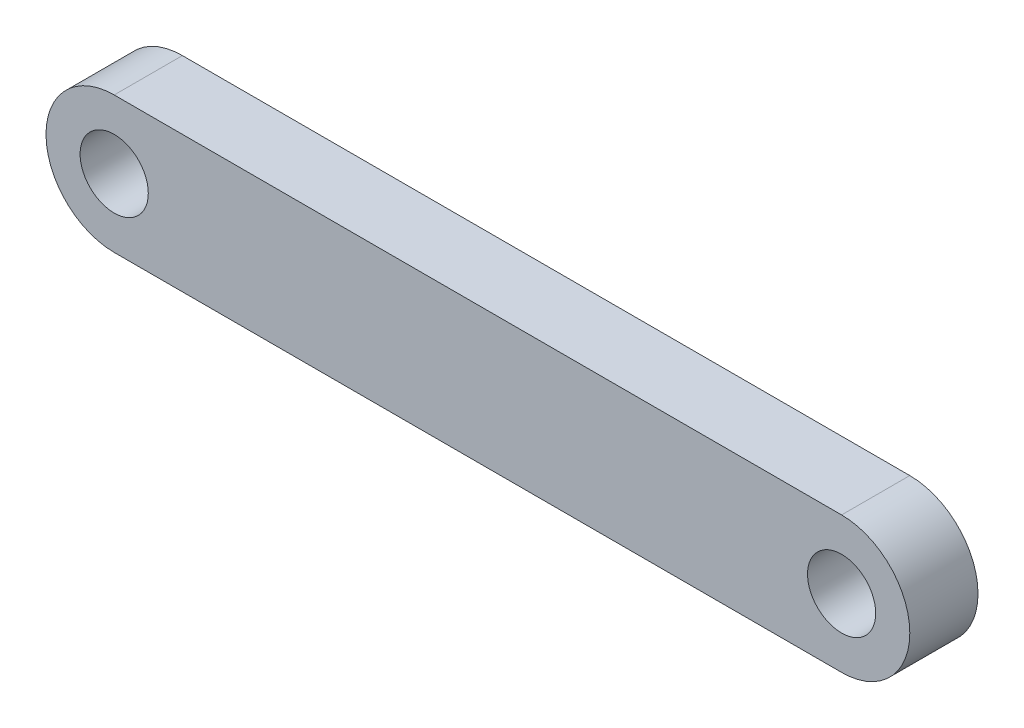
ISO-10303-21;
HEADER;
FILE_DESCRIPTION(('STEP AP214'),'2;1');
FILE_NAME('part.step','',(''),(''),'','','');
FILE_SCHEMA(('AUTOMOTIVE_DESIGN { 1 0 10303 214 1 1 1 1 }'));
ENDSEC;
DATA;
#1=APPLICATION_CONTEXT('core data for automotive mechanical design processes');
#2=APPLICATION_PROTOCOL_DEFINITION('international standard','automotive_design',2000,#1);
#3=PRODUCT_CONTEXT('',#1,'mechanical');
#4=PRODUCT('Part','Part','',(#3));
#5=PRODUCT_RELATED_PRODUCT_CATEGORY('part','',(#4));
#6=PRODUCT_DEFINITION_FORMATION('','',#4);
#7=PRODUCT_DEFINITION_CONTEXT('part definition',#1,'design');
#8=PRODUCT_DEFINITION('design','',#6,#7);
#9=PRODUCT_DEFINITION_SHAPE('','',#8);
#10=(LENGTH_UNIT() NAMED_UNIT(*) SI_UNIT(.MILLI.,.METRE.));
#11=(NAMED_UNIT(*) PLANE_ANGLE_UNIT() SI_UNIT($,.RADIAN.));
#12=(NAMED_UNIT(*) SI_UNIT($,.STERADIAN.) SOLID_ANGLE_UNIT());
#13=UNCERTAINTY_MEASURE_WITH_UNIT(LENGTH_MEASURE(1.E-05),#10,'distance_accuracy_value','');
#14=(GEOMETRIC_REPRESENTATION_CONTEXT(3) GLOBAL_UNCERTAINTY_ASSIGNED_CONTEXT((#13)) GLOBAL_UNIT_ASSIGNED_CONTEXT((#10,
#11,#12)) REPRESENTATION_CONTEXT('',''));
#15=CARTESIAN_POINT('',(0.,0.,0.));
#16=DIRECTION('',(0.,0.,1.));
#17=DIRECTION('',(1.,0.,0.));
#18=AXIS2_PLACEMENT_3D('',#15,#16,#17);
#19=CARTESIAN_POINT('',(0.,0.,3.));
#20=DIRECTION('',(0.,0.,1.));
#21=DIRECTION('',(1.,0.,0.));
#22=AXIS2_PLACEMENT_3D('',#19,#20,#21);
#23=PLANE('',#22);
#24=CARTESIAN_POINT('',(-32.,0.,3.));
#25=DIRECTION('',(0.,0.,1.));
#26=DIRECTION('',(1.,0.,0.));
#27=AXIS2_PLACEMENT_3D('',#24,#25,#26);
#28=CIRCLE('',#27,1.5);
#29=CARTESIAN_POINT('',(-30.5,0.,3.));
#30=VERTEX_POINT('',#29);
#31=EDGE_CURVE('E112',#30,#30,#28,.T.);
#32=ORIENTED_EDGE('',*,*,#31,.F.);
#33=EDGE_LOOP('',(#32));
#34=FACE_BOUND('',#33,.T.);
#35=CARTESIAN_POINT('',(0.,0.,3.));
#36=DIRECTION('',(0.,0.,1.));
#37=DIRECTION('',(1.,0.,0.));
#38=AXIS2_PLACEMENT_3D('',#35,#36,#37);
#39=CIRCLE('',#38,3.);
#40=CARTESIAN_POINT('',(0.,-3.,3.));
#41=VERTEX_POINT('',#40);
#42=CARTESIAN_POINT('',(0.,3.,3.));
#43=VERTEX_POINT('',#42);
#44=EDGE_CURVE('E92',#41,#43,#39,.T.);
#45=ORIENTED_EDGE('',*,*,#44,.T.);
#46=DIRECTION('',(-1.,0.,0.));
#47=VECTOR('',#46,1.);
#48=CARTESIAN_POINT('',(-32.,3.,3.));
#49=LINE('',#48,#47);
#50=CARTESIAN_POINT('',(-32.,3.,3.));
#51=VERTEX_POINT('',#50);
#52=EDGE_CURVE('E87',#43,#51,#49,.T.);
#53=ORIENTED_EDGE('',*,*,#52,.T.);
#54=CARTESIAN_POINT('',(-32.,0.,3.));
#55=DIRECTION('',(0.,0.,1.));
#56=DIRECTION('',(1.,0.,0.));
#57=AXIS2_PLACEMENT_3D('',#54,#55,#56);
#58=CIRCLE('',#57,3.);
#59=CARTESIAN_POINT('',(-32.,-3.,3.));
#60=VERTEX_POINT('',#59);
#61=EDGE_CURVE('E90',#51,#60,#58,.T.);
#62=ORIENTED_EDGE('',*,*,#61,.T.);
#63=DIRECTION('',(1.,0.,0.));
#64=VECTOR('',#63,1.);
#65=CARTESIAN_POINT('',(-32.,-3.,3.));
#66=LINE('',#65,#64);
#67=EDGE_CURVE('E57',#60,#41,#66,.T.);
#68=ORIENTED_EDGE('',*,*,#67,.T.);
#69=EDGE_LOOP('',(#45,#53,#62,#68));
#70=FACE_BOUND('',#69,.T.);
#71=CARTESIAN_POINT('',(0.,0.,3.));
#72=DIRECTION('',(0.,0.,1.));
#73=DIRECTION('',(1.,0.,0.));
#74=AXIS2_PLACEMENT_3D('',#71,#72,#73);
#75=CIRCLE('',#74,1.5);
#76=CARTESIAN_POINT('',(1.5,0.,3.));
#77=VERTEX_POINT('',#76);
#78=EDGE_CURVE('E134',#77,#77,#75,.T.);
#79=ORIENTED_EDGE('',*,*,#78,.F.);
#80=EDGE_LOOP('',(#79));
#81=FACE_BOUND('',#80,.T.);
#82=ADVANCED_FACE('F39',(#34,#70,#81),#23,.T.);
#83=CARTESIAN_POINT('',(0.,0.,0.));
#84=DIRECTION('',(0.,0.,1.));
#85=DIRECTION('',(1.,0.,0.));
#86=AXIS2_PLACEMENT_3D('',#83,#84,#85);
#87=PLANE('',#86);
#88=CARTESIAN_POINT('',(0.,0.,0.));
#89=DIRECTION('',(0.,0.,1.));
#90=DIRECTION('',(1.,0.,0.));
#91=AXIS2_PLACEMENT_3D('',#88,#89,#90);
#92=CIRCLE('',#91,3.);
#93=CARTESIAN_POINT('',(0.,-3.,0.));
#94=VERTEX_POINT('',#93);
#95=CARTESIAN_POINT('',(0.,3.,0.));
#96=VERTEX_POINT('',#95);
#97=EDGE_CURVE('E108',#94,#96,#92,.T.);
#98=ORIENTED_EDGE('',*,*,#97,.F.);
#99=DIRECTION('',(1.,0.,0.));
#100=VECTOR('',#99,1.);
#101=CARTESIAN_POINT('',(-32.,-3.,0.));
#102=LINE('',#101,#100);
#103=CARTESIAN_POINT('',(-32.,-3.,0.));
#104=VERTEX_POINT('',#103);
#105=EDGE_CURVE('E80',#104,#94,#102,.T.);
#106=ORIENTED_EDGE('',*,*,#105,.F.);
#107=CARTESIAN_POINT('',(-32.,0.,0.));
#108=DIRECTION('',(0.,0.,1.));
#109=DIRECTION('',(1.,0.,0.));
#110=AXIS2_PLACEMENT_3D('',#107,#108,#109);
#111=CIRCLE('',#110,3.);
#112=CARTESIAN_POINT('',(-32.,3.,0.));
#113=VERTEX_POINT('',#112);
#114=EDGE_CURVE('E74',#113,#104,#111,.T.);
#115=ORIENTED_EDGE('',*,*,#114,.F.);
#116=DIRECTION('',(-1.,0.,0.));
#117=VECTOR('',#116,1.);
#118=CARTESIAN_POINT('',(-32.,3.,0.));
#119=LINE('',#118,#117);
#120=EDGE_CURVE('E97',#96,#113,#119,.T.);
#121=ORIENTED_EDGE('',*,*,#120,.F.);
#122=EDGE_LOOP('',(#98,#106,#115,#121));
#123=FACE_BOUND('',#122,.T.);
#124=CARTESIAN_POINT('',(-32.,0.,0.));
#125=DIRECTION('',(0.,0.,1.));
#126=DIRECTION('',(1.,0.,0.));
#127=AXIS2_PLACEMENT_3D('',#124,#125,#126);
#128=CIRCLE('',#127,1.5);
#129=CARTESIAN_POINT('',(-30.5,0.,0.));
#130=VERTEX_POINT('',#129);
#131=EDGE_CURVE('E130',#130,#130,#128,.T.);
#132=ORIENTED_EDGE('',*,*,#131,.T.);
#133=EDGE_LOOP('',(#132));
#134=FACE_BOUND('',#133,.T.);
#135=CARTESIAN_POINT('',(0.,0.,0.));
#136=DIRECTION('',(0.,0.,1.));
#137=DIRECTION('',(1.,0.,0.));
#138=AXIS2_PLACEMENT_3D('',#135,#136,#137);
#139=CIRCLE('',#138,1.5);
#140=CARTESIAN_POINT('',(1.5,0.,0.));
#141=VERTEX_POINT('',#140);
#142=EDGE_CURVE('E138',#141,#141,#139,.T.);
#143=ORIENTED_EDGE('',*,*,#142,.T.);
#144=EDGE_LOOP('',(#143));
#145=FACE_BOUND('',#144,.T.);
#146=ADVANCED_FACE('F125',(#123,#134,#145),#87,.F.);
#147=CARTESIAN_POINT('',(0.,0.,3.));
#148=DIRECTION('',(0.,0.,-1.));
#149=DIRECTION('',(-1.,0.,0.));
#150=AXIS2_PLACEMENT_3D('',#147,#148,#149);
#151=CYLINDRICAL_SURFACE('',#150,3.);
#152=ORIENTED_EDGE('',*,*,#97,.T.);
#153=DIRECTION('',(0.,0.,-1.));
#154=VECTOR('',#153,1.);
#155=CARTESIAN_POINT('',(0.,3.,3.));
#156=LINE('',#155,#154);
#157=EDGE_CURVE('E11',#43,#96,#156,.T.);
#158=ORIENTED_EDGE('',*,*,#157,.F.);
#159=ORIENTED_EDGE('',*,*,#44,.F.);
#160=DIRECTION('',(0.,0.,-1.));
#161=VECTOR('',#160,1.);
#162=CARTESIAN_POINT('',(0.,-3.,3.));
#163=LINE('',#162,#161);
#164=EDGE_CURVE('E104',#41,#94,#163,.T.);
#165=ORIENTED_EDGE('',*,*,#164,.T.);
#166=EDGE_LOOP('',(#152,#158,#159,#165));
#167=FACE_BOUND('',#166,.T.);
#168=ADVANCED_FACE('F41',(#167),#151,.T.);
#169=CARTESIAN_POINT('',(-32.,3.,3.));
#170=DIRECTION('',(0.,-1.,0.));
#171=DIRECTION('',(1.,0.,0.));
#172=AXIS2_PLACEMENT_3D('',#169,#170,#171);
#173=PLANE('',#172);
#174=ORIENTED_EDGE('',*,*,#120,.T.);
#175=DIRECTION('',(0.,0.,-1.));
#176=VECTOR('',#175,1.);
#177=CARTESIAN_POINT('',(-32.,3.,3.));
#178=LINE('',#177,#176);
#179=EDGE_CURVE('E49',#51,#113,#178,.T.);
#180=ORIENTED_EDGE('',*,*,#179,.F.);
#181=ORIENTED_EDGE('',*,*,#52,.F.);
#182=ORIENTED_EDGE('',*,*,#157,.T.);
#183=EDGE_LOOP('',(#174,#180,#181,#182));
#184=FACE_BOUND('',#183,.T.);
#185=ADVANCED_FACE('F96',(#184),#173,.F.);
#186=CARTESIAN_POINT('',(-32.,0.,3.));
#187=DIRECTION('',(0.,0.,-1.));
#188=DIRECTION('',(-1.,0.,0.));
#189=AXIS2_PLACEMENT_3D('',#186,#187,#188);
#190=CYLINDRICAL_SURFACE('',#189,3.);
#191=ORIENTED_EDGE('',*,*,#114,.T.);
#192=DIRECTION('',(0.,0.,-1.));
#193=VECTOR('',#192,1.);
#194=CARTESIAN_POINT('',(-32.,-3.,3.));
#195=LINE('',#194,#193);
#196=EDGE_CURVE('E99',#60,#104,#195,.T.);
#197=ORIENTED_EDGE('',*,*,#196,.F.);
#198=ORIENTED_EDGE('',*,*,#61,.F.);
#199=ORIENTED_EDGE('',*,*,#179,.T.);
#200=EDGE_LOOP('',(#191,#197,#198,#199));
#201=FACE_BOUND('',#200,.T.);
#202=ADVANCED_FACE('F100',(#201),#190,.T.);
#203=CARTESIAN_POINT('',(-32.,-3.,3.));
#204=DIRECTION('',(0.,1.,0.));
#205=DIRECTION('',(-1.,0.,0.));
#206=AXIS2_PLACEMENT_3D('',#203,#204,#205);
#207=PLANE('',#206);
#208=ORIENTED_EDGE('',*,*,#105,.T.);
#209=ORIENTED_EDGE('',*,*,#164,.F.);
#210=ORIENTED_EDGE('',*,*,#67,.F.);
#211=ORIENTED_EDGE('',*,*,#196,.T.);
#212=EDGE_LOOP('',(#208,#209,#210,#211));
#213=FACE_BOUND('',#212,.T.);
#214=ADVANCED_FACE('F122',(#213),#207,.F.);
#215=CARTESIAN_POINT('',(-32.,0.,3.));
#216=DIRECTION('',(0.,0.,-1.));
#217=DIRECTION('',(-1.,0.,0.));
#218=AXIS2_PLACEMENT_3D('',#215,#216,#217);
#219=CYLINDRICAL_SURFACE('',#218,1.5);
#220=ORIENTED_EDGE('',*,*,#31,.T.);
#221=EDGE_LOOP('',(#220));
#222=FACE_BOUND('',#221,.T.);
#223=ORIENTED_EDGE('',*,*,#131,.F.);
#224=EDGE_LOOP('',(#223));
#225=FACE_BOUND('',#224,.T.);
#226=ADVANCED_FACE('F157',(#222,#225),#219,.F.);
#227=CARTESIAN_POINT('',(0.,0.,3.));
#228=DIRECTION('',(0.,0.,-1.));
#229=DIRECTION('',(-1.,0.,0.));
#230=AXIS2_PLACEMENT_3D('',#227,#228,#229);
#231=CYLINDRICAL_SURFACE('',#230,1.5);
#232=ORIENTED_EDGE('',*,*,#78,.T.);
#233=EDGE_LOOP('',(#232));
#234=FACE_BOUND('',#233,.T.);
#235=ORIENTED_EDGE('',*,*,#142,.F.);
#236=EDGE_LOOP('',(#235));
#237=FACE_BOUND('',#236,.T.);
#238=ADVANCED_FACE('F146',(#234,#237),#231,.F.);
#239=CLOSED_SHELL('',(#82,#146,#168,#185,#202,#214,#226,#238));
#240=MANIFOLD_SOLID_BREP('B2',#239);
#241=ADVANCED_BREP_SHAPE_REPRESENTATION('',(#18,#240),#14);
#242=SHAPE_DEFINITION_REPRESENTATION(#9,#241);
ENDSEC;
END-ISO-10303-21;
